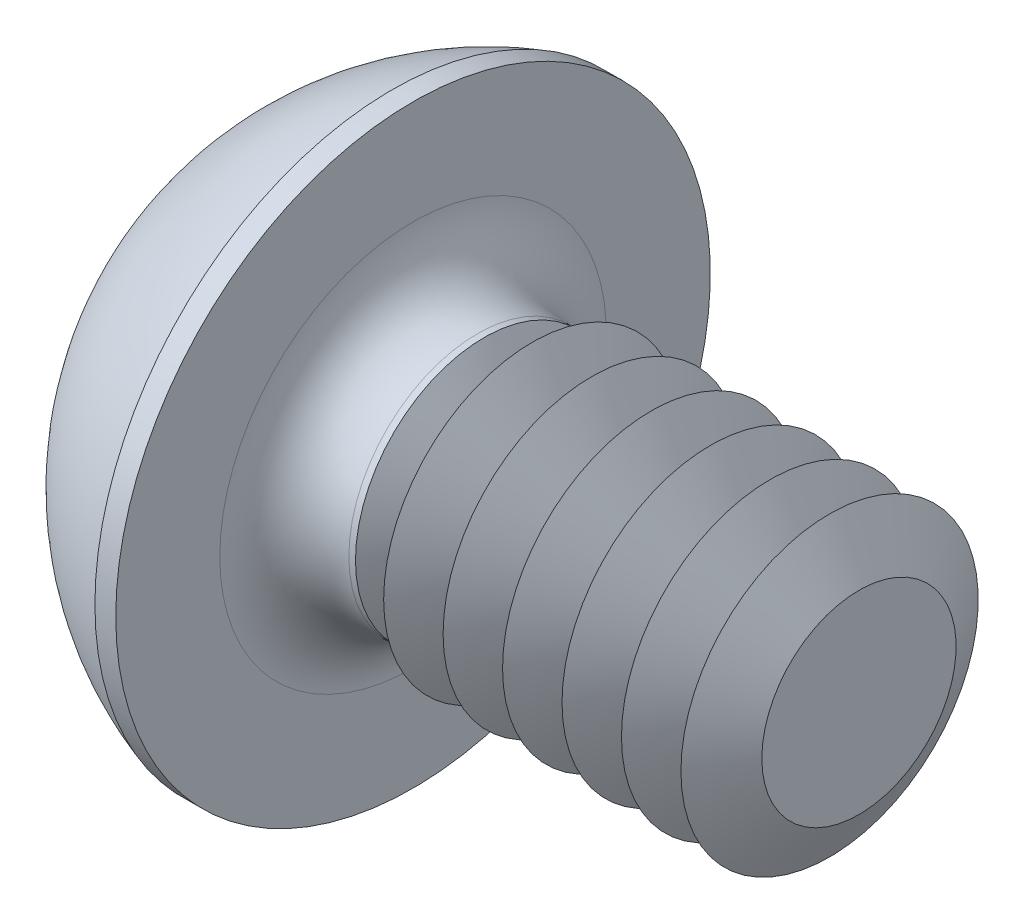
ISO-10303-21;
HEADER;
FILE_DESCRIPTION(('STEP AP214'),'2;1');
FILE_NAME('part.step','',(''),(''),'','','');
FILE_SCHEMA(('AUTOMOTIVE_DESIGN { 1 0 10303 214 1 1 1 1 }'));
ENDSEC;
DATA;
#1=APPLICATION_CONTEXT('core data for automotive mechanical design processes');
#2=APPLICATION_PROTOCOL_DEFINITION('international standard','automotive_design',2000,#1);
#3=PRODUCT_CONTEXT('',#1,'mechanical');
#4=PRODUCT('Part','Part','',(#3));
#5=PRODUCT_RELATED_PRODUCT_CATEGORY('part','',(#4));
#6=PRODUCT_DEFINITION_FORMATION('','',#4);
#7=PRODUCT_DEFINITION_CONTEXT('part definition',#1,'design');
#8=PRODUCT_DEFINITION('design','',#6,#7);
#9=PRODUCT_DEFINITION_SHAPE('','',#8);
#10=(LENGTH_UNIT() NAMED_UNIT(*) SI_UNIT(.MILLI.,.METRE.));
#11=(NAMED_UNIT(*) PLANE_ANGLE_UNIT() SI_UNIT($,.RADIAN.));
#12=(NAMED_UNIT(*) SI_UNIT($,.STERADIAN.) SOLID_ANGLE_UNIT());
#13=UNCERTAINTY_MEASURE_WITH_UNIT(LENGTH_MEASURE(1.E-05),#10,'distance_accuracy_value','');
#14=(GEOMETRIC_REPRESENTATION_CONTEXT(3) GLOBAL_UNCERTAINTY_ASSIGNED_CONTEXT((#13)) GLOBAL_UNIT_ASSIGNED_CONTEXT((#10,
#11,#12)) REPRESENTATION_CONTEXT('',''));
#15=CARTESIAN_POINT('',(0.,0.,0.));
#16=DIRECTION('',(0.,0.,1.));
#17=DIRECTION('',(1.,0.,0.));
#18=AXIS2_PLACEMENT_3D('',#15,#16,#17);
#19=CARTESIAN_POINT('',(1.2,0.,0.));
#20=DIRECTION('',(0.164398987305357,0.,-0.986393923832144));
#21=DIRECTION('',(-0.986393923832144,0.,-0.164398987305357));
#22=AXIS2_PLACEMENT_3D('',#19,#20,#21);
#23=PLANE('',#22);
#24=DIRECTION('',(-0.777436258070084,-0.61547037097215,-0.129572709678347));
#25=VECTOR('',#24,1.);
#26=CARTESIAN_POINT('',(1.2,0.,0.));
#27=LINE('',#26,#25);
#28=CARTESIAN_POINT('',(1.2,0.,0.));
#29=VERTEX_POINT('',#28);
#30=CARTESIAN_POINT('',(0.171781586834319,-0.814006243756164,-0.171369735527614));
#31=VERTEX_POINT('',#30);
#32=EDGE_CURVE('E155',#29,#31,#27,.T.);
#33=ORIENTED_EDGE('',*,*,#32,.F.);
#34=DIRECTION('',(-0.973328526784575,-0.162221421130762,-0.162221421130763));
#35=VECTOR('',#34,1.);
#36=CARTESIAN_POINT('',(1.2,0.,0.));
#37=LINE('',#36,#35);
#38=CARTESIAN_POINT('',(0.0185453159762638,-0.196909114003955,-0.196909114003956));
#39=VERTEX_POINT('',#38);
#40=EDGE_CURVE('E116',#29,#39,#37,.T.);
#41=ORIENTED_EDGE('',*,*,#40,.T.);
#42=CARTESIAN_POINT('',(2.07567567567568,0.,0.145945945945946));
#43=DIRECTION('',(0.164398987305357,0.,-0.986393923832144));
#44=DIRECTION('',(-0.986393923832144,0.,-0.164398987305357));
#45=AXIS2_PLACEMENT_3D('',#42,#43,#44);
#46=CIRCLE('',#45,2.09478115995636);
#47=EDGE_CURVE('E129',#31,#39,#46,.T.);
#48=ORIENTED_EDGE('',*,*,#47,.F.);
#49=EDGE_LOOP('',(#33,#41,#48));
#50=FACE_BOUND('',#49,.T.);
#51=ADVANCED_FACE('F36',(#50),#23,.F.);
#52=CARTESIAN_POINT('',(1.2,0.,0.));
#53=DIRECTION('',(0.164398987305357,0.,0.986393923832144));
#54=DIRECTION('',(0.986393923832144,0.,-0.164398987305357));
#55=AXIS2_PLACEMENT_3D('',#52,#53,#54);
#56=PLANE('',#55);
#57=CARTESIAN_POINT('',(2.07567567567568,0.,-0.145945945945946));
#58=DIRECTION('',(0.164398987305357,0.,0.986393923832144));
#59=DIRECTION('',(0.986393923832144,0.,-0.164398987305357));
#60=AXIS2_PLACEMENT_3D('',#57,#58,#59);
#61=CIRCLE('',#60,2.09478115995636);
#62=CARTESIAN_POINT('',(0.0185453159762634,-0.196909114003957,0.196909114003956));
#63=VERTEX_POINT('',#62);
#64=CARTESIAN_POINT('',(0.171781586834319,-0.814006243756164,0.171369735527614));
#65=VERTEX_POINT('',#64);
#66=EDGE_CURVE('E59',#63,#65,#61,.T.);
#67=ORIENTED_EDGE('',*,*,#66,.F.);
#68=DIRECTION('',(0.973328526784575,0.162221421130763,-0.162221421130763));
#69=VECTOR('',#68,1.);
#70=CARTESIAN_POINT('',(1.2,0.,0.));
#71=LINE('',#70,#69);
#72=EDGE_CURVE('E11',#63,#29,#71,.T.);
#73=ORIENTED_EDGE('',*,*,#72,.T.);
#74=DIRECTION('',(-0.777436258070084,-0.61547037097215,0.129572709678347));
#75=VECTOR('',#74,1.);
#76=CARTESIAN_POINT('',(1.2,0.,0.));
#77=LINE('',#76,#75);
#78=EDGE_CURVE('E156',#29,#65,#77,.T.);
#79=ORIENTED_EDGE('',*,*,#78,.T.);
#80=EDGE_LOOP('',(#67,#73,#79));
#81=FACE_BOUND('',#80,.T.);
#82=ADVANCED_FACE('F171',(#81),#56,.F.);
#83=CARTESIAN_POINT('',(3.20216640229767,0.,0.));
#84=DIRECTION('',(-1.,0.,0.));
#85=DIRECTION('',(0.,0.,1.));
#86=AXIS2_PLACEMENT_3D('',#83,#84,#85);
#87=CONICAL_SURFACE('',#86,0.999999999999995,1.05188801855284);
#88=CARTESIAN_POINT('',(3.4,0.,0.));
#89=DIRECTION('',(-1.,0.,0.));
#90=DIRECTION('',(0.,0.,1.));
#91=AXIS2_PLACEMENT_3D('',#88,#89,#90);
#92=CIRCLE('',#91,0.653599999999999);
#93=CARTESIAN_POINT('',(3.4,0.,0.653599999999999));
#94=VERTEX_POINT('',#93);
#95=EDGE_CURVE('E205',#94,#94,#92,.T.);
#96=ORIENTED_EDGE('',*,*,#95,.T.);
#97=EDGE_LOOP('',(#96));
#98=FACE_BOUND('',#97,.T.);
#99=CARTESIAN_POINT('',(3.20216640229768,0.,0.));
#100=DIRECTION('',(-1.,0.,0.));
#101=DIRECTION('',(0.,0.,1.));
#102=AXIS2_PLACEMENT_3D('',#99,#100,#101);
#103=CIRCLE('',#102,0.999999999999994);
#104=CARTESIAN_POINT('',(3.20216640229768,0.,0.999999999999994));
#105=VERTEX_POINT('',#104);
#106=EDGE_CURVE('E202',#105,#105,#103,.T.);
#107=ORIENTED_EDGE('',*,*,#106,.F.);
#108=EDGE_LOOP('',(#107));
#109=FACE_BOUND('',#108,.T.);
#110=ADVANCED_FACE('F279',(#98,#109),#87,.T.);
#111=CARTESIAN_POINT('',(3.4,0.,0.));
#112=DIRECTION('',(1.,0.,0.));
#113=DIRECTION('',(0.,0.,-1.));
#114=AXIS2_PLACEMENT_3D('',#111,#112,#113);
#115=CONICAL_SURFACE('',#114,0.653599999999999,1.04250708384035);
#116=CARTESIAN_POINT('',(3.60216640229768,0.,0.));
#117=DIRECTION('',(-1.,0.,0.));
#118=DIRECTION('',(0.,0.,1.));
#119=AXIS2_PLACEMENT_3D('',#116,#117,#118);
#120=CIRCLE('',#119,0.999999999999994);
#121=CARTESIAN_POINT('',(3.60216640229768,0.,0.999999999999994));
#122=VERTEX_POINT('',#121);
#123=EDGE_CURVE('E208',#122,#122,#120,.T.);
#124=ORIENTED_EDGE('',*,*,#123,.T.);
#125=EDGE_LOOP('',(#124));
#126=FACE_BOUND('',#125,.T.);
#127=ORIENTED_EDGE('',*,*,#95,.F.);
#128=EDGE_LOOP('',(#127));
#129=FACE_BOUND('',#128,.T.);
#130=ADVANCED_FACE('F457',(#126,#129),#115,.T.);
#131=CARTESIAN_POINT('',(4.6,0.,0.));
#132=DIRECTION('',(-1.,0.,0.));
#133=DIRECTION('',(0.,0.,1.));
#134=AXIS2_PLACEMENT_3D('',#131,#132,#133);
#135=PLANE('',#134);
#136=CARTESIAN_POINT('',(4.6,0.,0.));
#137=DIRECTION('',(-1.,0.,0.));
#138=DIRECTION('',(0.,0.,1.));
#139=AXIS2_PLACEMENT_3D('',#136,#137,#138);
#140=CIRCLE('',#139,0.653599999999999);
#141=CARTESIAN_POINT('',(4.6,0.,0.653599999999999));
#142=VERTEX_POINT('',#141);
#143=EDGE_CURVE('E223',#142,#142,#140,.T.);
#144=ORIENTED_EDGE('',*,*,#143,.F.);
#145=EDGE_LOOP('',(#144));
#146=FACE_BOUND('',#145,.T.);
#147=ADVANCED_FACE('F461',(#146),#135,.F.);
#148=CARTESIAN_POINT('',(4.40216640229768,0.,0.));
#149=DIRECTION('',(-1.,0.,0.));
#150=DIRECTION('',(0.,0.,1.));
#151=AXIS2_PLACEMENT_3D('',#148,#149,#150);
#152=CONICAL_SURFACE('',#151,0.999999999999995,1.05188801855284);
#153=ORIENTED_EDGE('',*,*,#143,.T.);
#154=EDGE_LOOP('',(#153));
#155=FACE_BOUND('',#154,.T.);
#156=CARTESIAN_POINT('',(4.40216640229768,0.,0.));
#157=DIRECTION('',(-1.,0.,0.));
#158=DIRECTION('',(0.,0.,1.));
#159=AXIS2_PLACEMENT_3D('',#156,#157,#158);
#160=CIRCLE('',#159,0.999999999999994);
#161=CARTESIAN_POINT('',(4.40216640229768,0.,0.999999999999994));
#162=VERTEX_POINT('',#161);
#163=EDGE_CURVE('E220',#162,#162,#160,.T.);
#164=ORIENTED_EDGE('',*,*,#163,.F.);
#165=EDGE_LOOP('',(#164));
#166=FACE_BOUND('',#165,.T.);
#167=ADVANCED_FACE('F449',(#155,#166),#152,.T.);
#168=CARTESIAN_POINT('',(4.2,0.,0.));
#169=DIRECTION('',(1.,0.,0.));
#170=DIRECTION('',(0.,0.,-1.));
#171=AXIS2_PLACEMENT_3D('',#168,#169,#170);
#172=CONICAL_SURFACE('',#171,0.653599999999999,1.04250708384035);
#173=ORIENTED_EDGE('',*,*,#163,.T.);
#174=EDGE_LOOP('',(#173));
#175=FACE_BOUND('',#174,.T.);
#176=CARTESIAN_POINT('',(4.2,0.,0.));
#177=DIRECTION('',(-1.,0.,0.));
#178=DIRECTION('',(0.,0.,1.));
#179=AXIS2_PLACEMENT_3D('',#176,#177,#178);
#180=CIRCLE('',#179,0.653599999999999);
#181=CARTESIAN_POINT('',(4.2,0.,0.653599999999999));
#182=VERTEX_POINT('',#181);
#183=EDGE_CURVE('E217',#182,#182,#180,.T.);
#184=ORIENTED_EDGE('',*,*,#183,.F.);
#185=EDGE_LOOP('',(#184));
#186=FACE_BOUND('',#185,.T.);
#187=ADVANCED_FACE('F439',(#175,#186),#172,.T.);
#188=CARTESIAN_POINT('',(4.00216640229768,0.,0.));
#189=DIRECTION('',(-1.,0.,0.));
#190=DIRECTION('',(0.,0.,1.));
#191=AXIS2_PLACEMENT_3D('',#188,#189,#190);
#192=CONICAL_SURFACE('',#191,0.999999999999995,1.05188801855284);
#193=ORIENTED_EDGE('',*,*,#183,.T.);
#194=EDGE_LOOP('',(#193));
#195=FACE_BOUND('',#194,.T.);
#196=CARTESIAN_POINT('',(4.00216640229768,0.,0.));
#197=DIRECTION('',(-1.,0.,0.));
#198=DIRECTION('',(0.,0.,1.));
#199=AXIS2_PLACEMENT_3D('',#196,#197,#198);
#200=CIRCLE('',#199,0.999999999999994);
#201=CARTESIAN_POINT('',(4.00216640229768,0.,0.999999999999994));
#202=VERTEX_POINT('',#201);
#203=EDGE_CURVE('E214',#202,#202,#200,.T.);
#204=ORIENTED_EDGE('',*,*,#203,.F.);
#205=EDGE_LOOP('',(#204));
#206=FACE_BOUND('',#205,.T.);
#207=ADVANCED_FACE('F429',(#195,#206),#192,.T.);
#208=CARTESIAN_POINT('',(3.8,0.,0.));
#209=DIRECTION('',(1.,0.,0.));
#210=DIRECTION('',(0.,0.,-1.));
#211=AXIS2_PLACEMENT_3D('',#208,#209,#210);
#212=CONICAL_SURFACE('',#211,0.653599999999999,1.04250708384035);
#213=ORIENTED_EDGE('',*,*,#203,.T.);
#214=EDGE_LOOP('',(#213));
#215=FACE_BOUND('',#214,.T.);
#216=CARTESIAN_POINT('',(3.8,0.,0.));
#217=DIRECTION('',(-1.,0.,0.));
#218=DIRECTION('',(0.,0.,1.));
#219=AXIS2_PLACEMENT_3D('',#216,#217,#218);
#220=CIRCLE('',#219,0.653599999999999);
#221=CARTESIAN_POINT('',(3.8,0.,0.653599999999999));
#222=VERTEX_POINT('',#221);
#223=EDGE_CURVE('E211',#222,#222,#220,.T.);
#224=ORIENTED_EDGE('',*,*,#223,.F.);
#225=EDGE_LOOP('',(#224));
#226=FACE_BOUND('',#225,.T.);
#227=ADVANCED_FACE('F419',(#215,#226),#212,.T.);
#228=CARTESIAN_POINT('',(3.60216640229768,0.,0.));
#229=DIRECTION('',(-1.,0.,0.));
#230=DIRECTION('',(0.,0.,1.));
#231=AXIS2_PLACEMENT_3D('',#228,#229,#230);
#232=CONICAL_SURFACE('',#231,0.999999999999995,1.05188801855284);
#233=ORIENTED_EDGE('',*,*,#223,.T.);
#234=EDGE_LOOP('',(#233));
#235=FACE_BOUND('',#234,.T.);
#236=ORIENTED_EDGE('',*,*,#123,.F.);
#237=EDGE_LOOP('',(#236));
#238=FACE_BOUND('',#237,.T.);
#239=ADVANCED_FACE('F409',(#235,#238),#232,.T.);
#240=CARTESIAN_POINT('',(2.80216640229768,0.,0.));
#241=DIRECTION('',(-1.,0.,0.));
#242=DIRECTION('',(0.,0.,1.));
#243=AXIS2_PLACEMENT_3D('',#240,#241,#242);
#244=CONICAL_SURFACE('',#243,0.999999999999995,1.05188801855284);
#245=CARTESIAN_POINT('',(3.,0.,0.));
#246=DIRECTION('',(-1.,0.,0.));
#247=DIRECTION('',(0.,0.,1.));
#248=AXIS2_PLACEMENT_3D('',#245,#246,#247);
#249=CIRCLE('',#248,0.653599999999999);
#250=CARTESIAN_POINT('',(3.,0.,0.653599999999999));
#251=VERTEX_POINT('',#250);
#252=EDGE_CURVE('E199',#251,#251,#249,.T.);
#253=ORIENTED_EDGE('',*,*,#252,.T.);
#254=EDGE_LOOP('',(#253));
#255=FACE_BOUND('',#254,.T.);
#256=CARTESIAN_POINT('',(2.80216640229768,0.,0.));
#257=DIRECTION('',(-1.,0.,0.));
#258=DIRECTION('',(0.,0.,1.));
#259=AXIS2_PLACEMENT_3D('',#256,#257,#258);
#260=CIRCLE('',#259,0.999999999999994);
#261=CARTESIAN_POINT('',(2.80216640229768,0.,0.999999999999994));
#262=VERTEX_POINT('',#261);
#263=EDGE_CURVE('E196',#262,#262,#260,.T.);
#264=ORIENTED_EDGE('',*,*,#263,.F.);
#265=EDGE_LOOP('',(#264));
#266=FACE_BOUND('',#265,.T.);
#267=ADVANCED_FACE('F399',(#255,#266),#244,.T.);
#268=CARTESIAN_POINT('',(3.,0.,0.));
#269=DIRECTION('',(1.,0.,0.));
#270=DIRECTION('',(0.,0.,-1.));
#271=AXIS2_PLACEMENT_3D('',#268,#269,#270);
#272=CONICAL_SURFACE('',#271,0.653599999999999,1.04250708384035);
#273=ORIENTED_EDGE('',*,*,#106,.T.);
#274=EDGE_LOOP('',(#273));
#275=FACE_BOUND('',#274,.T.);
#276=ORIENTED_EDGE('',*,*,#252,.F.);
#277=EDGE_LOOP('',(#276));
#278=FACE_BOUND('',#277,.T.);
#279=ADVANCED_FACE('F389',(#275,#278),#272,.T.);
#280=CARTESIAN_POINT('',(2.40216640229767,0.,0.));
#281=DIRECTION('',(-1.,0.,0.));
#282=DIRECTION('',(0.,0.,1.));
#283=AXIS2_PLACEMENT_3D('',#280,#281,#282);
#284=CONICAL_SURFACE('',#283,0.999999999999995,1.05188801855284);
#285=CARTESIAN_POINT('',(2.6,0.,0.));
#286=DIRECTION('',(-1.,0.,0.));
#287=DIRECTION('',(0.,0.,1.));
#288=AXIS2_PLACEMENT_3D('',#285,#286,#287);
#289=CIRCLE('',#288,0.653599999999999);
#290=CARTESIAN_POINT('',(2.6,0.,0.653599999999999));
#291=VERTEX_POINT('',#290);
#292=EDGE_CURVE('E193',#291,#291,#289,.T.);
#293=ORIENTED_EDGE('',*,*,#292,.T.);
#294=EDGE_LOOP('',(#293));
#295=FACE_BOUND('',#294,.T.);
#296=CARTESIAN_POINT('',(2.40216640229767,0.,0.));
#297=DIRECTION('',(-1.,0.,0.));
#298=DIRECTION('',(0.,0.,1.));
#299=AXIS2_PLACEMENT_3D('',#296,#297,#298);
#300=CIRCLE('',#299,0.999999999999994);
#301=CARTESIAN_POINT('',(2.40216640229767,0.,0.999999999999994));
#302=VERTEX_POINT('',#301);
#303=EDGE_CURVE('E190',#302,#302,#300,.T.);
#304=ORIENTED_EDGE('',*,*,#303,.F.);
#305=EDGE_LOOP('',(#304));
#306=FACE_BOUND('',#305,.T.);
#307=ADVANCED_FACE('F271',(#295,#306),#284,.T.);
#308=CARTESIAN_POINT('',(2.6,0.,0.));
#309=DIRECTION('',(1.,0.,0.));
#310=DIRECTION('',(0.,0.,-1.));
#311=AXIS2_PLACEMENT_3D('',#308,#309,#310);
#312=CONICAL_SURFACE('',#311,0.653599999999999,1.04250708384035);
#313=ORIENTED_EDGE('',*,*,#263,.T.);
#314=EDGE_LOOP('',(#313));
#315=FACE_BOUND('',#314,.T.);
#316=ORIENTED_EDGE('',*,*,#292,.F.);
#317=EDGE_LOOP('',(#316));
#318=FACE_BOUND('',#317,.T.);
#319=ADVANCED_FACE('F262',(#315,#318),#312,.T.);
#320=CARTESIAN_POINT('',(2.00216640229768,0.,0.));
#321=DIRECTION('',(-1.,0.,0.));
#322=DIRECTION('',(0.,0.,1.));
#323=AXIS2_PLACEMENT_3D('',#320,#321,#322);
#324=CONICAL_SURFACE('',#323,0.999999999999995,1.05188801855284);
#325=CARTESIAN_POINT('',(2.2,0.,0.));
#326=DIRECTION('',(-1.,0.,0.));
#327=DIRECTION('',(0.,0.,1.));
#328=AXIS2_PLACEMENT_3D('',#325,#326,#327);
#329=CIRCLE('',#328,0.653599999999999);
#330=CARTESIAN_POINT('',(2.2,0.,0.653599999999999));
#331=VERTEX_POINT('',#330);
#332=EDGE_CURVE('E160',#331,#331,#329,.T.);
#333=ORIENTED_EDGE('',*,*,#332,.T.);
#334=EDGE_LOOP('',(#333));
#335=FACE_BOUND('',#334,.T.);
#336=CARTESIAN_POINT('',(2.07869556538114,0.,0.));
#337=DIRECTION('',(-1.,0.,0.));
#338=DIRECTION('',(0.,0.,1.));
#339=AXIS2_PLACEMENT_3D('',#336,#337,#338);
#340=CIRCLE('',#339,0.866);
#341=CARTESIAN_POINT('',(2.07869556538114,0.,0.866));
#342=VERTEX_POINT('',#341);
#343=EDGE_CURVE('E179',#342,#342,#340,.F.);
#344=ORIENTED_EDGE('',*,*,#343,.T.);
#345=EDGE_LOOP('',(#344));
#346=FACE_BOUND('',#345,.T.);
#347=ADVANCED_FACE('F259',(#335,#346),#324,.T.);
#348=CARTESIAN_POINT('',(2.2,0.,0.));
#349=DIRECTION('',(1.,0.,0.));
#350=DIRECTION('',(0.,0.,-1.));
#351=AXIS2_PLACEMENT_3D('',#348,#349,#350);
#352=CONICAL_SURFACE('',#351,0.653599999999999,1.04250708384035);
#353=ORIENTED_EDGE('',*,*,#303,.T.);
#354=EDGE_LOOP('',(#353));
#355=FACE_BOUND('',#354,.T.);
#356=ORIENTED_EDGE('',*,*,#332,.F.);
#357=EDGE_LOOP('',(#356));
#358=FACE_BOUND('',#357,.T.);
#359=ADVANCED_FACE('F261',(#355,#358),#352,.T.);
#360=CARTESIAN_POINT('',(2.1,0.,0.));
#361=DIRECTION('',(-1.,0.,0.));
#362=DIRECTION('',(0.,1.,0.));
#363=AXIS2_PLACEMENT_3D('',#360,#361,#362);
#364=SPHERICAL_SURFACE('',#363,2.1);
#365=CARTESIAN_POINT('',(1.75325506937033,0.,-0.437993596584845));
#366=DIRECTION('',(0.620702944365561,0.,0.784045824461761));
#367=DIRECTION('',(0.784045824461762,0.,-0.620702944365561));
#368=AXIS2_PLACEMENT_3D('',#365,#366,#367);
#369=CIRCLE('',#368,2.0243343504553);
#370=CARTESIAN_POINT('',(0.171781586834319,0.171369735527611,0.814006243756165));
#371=VERTEX_POINT('',#370);
#372=CARTESIAN_POINT('',(0.171781586834319,-0.171369735527616,0.814006243756164));
#373=VERTEX_POINT('',#372);
#374=EDGE_CURVE('E122',#371,#373,#369,.T.);
#375=ORIENTED_EDGE('',*,*,#374,.T.);
#376=CARTESIAN_POINT('',(2.07567567567568,0.145945945945946,0.));
#377=DIRECTION('',(0.164398987305357,-0.986393923832144,0.));
#378=DIRECTION('',(0.986393923832144,0.164398987305357,0.));
#379=AXIS2_PLACEMENT_3D('',#376,#377,#378);
#380=CIRCLE('',#379,2.09478115995636);
#381=EDGE_CURVE('E138',#373,#63,#380,.T.);
#382=ORIENTED_EDGE('',*,*,#381,.T.);
#383=ORIENTED_EDGE('',*,*,#66,.T.);
#384=CARTESIAN_POINT('',(1.75325506937033,0.437993596584845,0.));
#385=DIRECTION('',(0.620702944365561,-0.784045824461761,0.));
#386=DIRECTION('',(0.784045824461762,0.620702944365561,0.));
#387=AXIS2_PLACEMENT_3D('',#384,#385,#386);
#388=CIRCLE('',#387,2.0243343504553);
#389=EDGE_CURVE('E168',#65,#31,#388,.T.);
#390=ORIENTED_EDGE('',*,*,#389,.T.);
#391=ORIENTED_EDGE('',*,*,#47,.T.);
#392=CARTESIAN_POINT('',(0.171781586834319,-0.171369735527611,-0.814006243756165));
#393=VERTEX_POINT('',#392);
#394=EDGE_CURVE('E118',#39,#393,#380,.T.);
#395=ORIENTED_EDGE('',*,*,#394,.T.);
#396=CARTESIAN_POINT('',(1.75325506937033,0.,0.437993596584845));
#397=DIRECTION('',(0.620702944365561,0.,-0.784045824461761));
#398=DIRECTION('',(-0.784045824461762,0.,-0.620702944365561));
#399=AXIS2_PLACEMENT_3D('',#396,#397,#398);
#400=CIRCLE('',#399,2.0243343504553);
#401=CARTESIAN_POINT('',(0.171781586834319,0.171369735527616,-0.814006243756164));
#402=VERTEX_POINT('',#401);
#403=EDGE_CURVE('E110',#393,#402,#400,.T.);
#404=ORIENTED_EDGE('',*,*,#403,.T.);
#405=CARTESIAN_POINT('',(2.07567567567568,-0.145945945945946,0.));
#406=DIRECTION('',(0.164398987305357,0.986393923832144,0.));
#407=DIRECTION('',(-0.986393923832144,0.164398987305357,0.));
#408=AXIS2_PLACEMENT_3D('',#405,#406,#407);
#409=CIRCLE('',#408,2.09478115995636);
#410=CARTESIAN_POINT('',(0.0185453159762634,0.196909114003957,-0.196909114003956));
#411=VERTEX_POINT('',#410);
#412=EDGE_CURVE('E101',#402,#411,#409,.T.);
#413=ORIENTED_EDGE('',*,*,#412,.T.);
#414=CARTESIAN_POINT('',(0.171781586834319,0.814006243756164,-0.171369735527614));
#415=VERTEX_POINT('',#414);
#416=EDGE_CURVE('E146',#411,#415,#46,.T.);
#417=ORIENTED_EDGE('',*,*,#416,.T.);
#418=CARTESIAN_POINT('',(1.75325506937033,-0.437993596584845,0.));
#419=DIRECTION('',(0.620702944365561,0.784045824461761,0.));
#420=DIRECTION('',(-0.784045824461762,0.620702944365561,0.));
#421=AXIS2_PLACEMENT_3D('',#418,#419,#420);
#422=CIRCLE('',#421,2.0243343504553);
#423=CARTESIAN_POINT('',(0.171781586834319,0.814006243756164,0.171369735527613));
#424=VERTEX_POINT('',#423);
#425=EDGE_CURVE('E159',#415,#424,#422,.T.);
#426=ORIENTED_EDGE('',*,*,#425,.T.);
#427=CARTESIAN_POINT('',(0.0185453159762634,0.196909114003955,0.196909114003956));
#428=VERTEX_POINT('',#427);
#429=EDGE_CURVE('E151',#424,#428,#61,.T.);
#430=ORIENTED_EDGE('',*,*,#429,.T.);
#431=EDGE_CURVE('E51',#428,#371,#409,.T.);
#432=ORIENTED_EDGE('',*,*,#431,.T.);
#433=EDGE_LOOP('',(#375,#382,#383,#390,#391,#395,#404,#413,#417,#426,#430,#432));
#434=FACE_BOUND('',#433,.T.);
#435=CARTESIAN_POINT('',(1.45968757625671,0.,0.));
#436=DIRECTION('',(-1.,0.,0.));
#437=DIRECTION('',(0.,0.,1.));
#438=AXIS2_PLACEMENT_3D('',#435,#436,#437);
#439=CIRCLE('',#438,2.);
#440=CARTESIAN_POINT('',(1.45968757625671,0.,2.));
#441=VERTEX_POINT('',#440);
#442=EDGE_CURVE('E172',#441,#441,#439,.T.);
#443=ORIENTED_EDGE('',*,*,#442,.T.);
#444=EDGE_LOOP('',(#443));
#445=FACE_BOUND('',#444,.T.);
#446=ADVANCED_FACE('F38',(#434,#445),#364,.T.);
#447=CARTESIAN_POINT('',(-1.33175770411172,0.,0.));
#448=DIRECTION('',(-1.,0.,0.));
#449=DIRECTION('',(0.,0.,1.));
#450=AXIS2_PLACEMENT_3D('',#447,#448,#449);
#451=CYLINDRICAL_SURFACE('',#450,2.);
#452=ORIENTED_EDGE('',*,*,#442,.F.);
#453=EDGE_LOOP('',(#452));
#454=FACE_BOUND('',#453,.T.);
#455=CARTESIAN_POINT('',(1.6,0.,0.));
#456=DIRECTION('',(-1.,0.,0.));
#457=DIRECTION('',(0.,0.,1.));
#458=AXIS2_PLACEMENT_3D('',#455,#456,#457);
#459=CIRCLE('',#458,2.);
#460=CARTESIAN_POINT('',(1.6,0.,2.));
#461=VERTEX_POINT('',#460);
#462=EDGE_CURVE('E175',#461,#461,#459,.T.);
#463=ORIENTED_EDGE('',*,*,#462,.T.);
#464=EDGE_LOOP('',(#463));
#465=FACE_BOUND('',#464,.T.);
#466=ADVANCED_FACE('F238',(#454,#465),#451,.T.);
#467=CARTESIAN_POINT('',(1.6,1.3,0.));
#468=DIRECTION('',(-1.,0.,0.));
#469=DIRECTION('',(0.,0.,1.));
#470=AXIS2_PLACEMENT_3D('',#467,#468,#469);
#471=PLANE('',#470);
#472=ORIENTED_EDGE('',*,*,#462,.F.);
#473=EDGE_LOOP('',(#472));
#474=FACE_BOUND('',#473,.T.);
#475=CARTESIAN_POINT('',(1.6,0.,0.));
#476=DIRECTION('',(-1.,0.,0.));
#477=DIRECTION('',(0.,0.,1.));
#478=AXIS2_PLACEMENT_3D('',#475,#476,#477);
#479=CIRCLE('',#478,1.3);
#480=CARTESIAN_POINT('',(1.6,0.,1.3));
#481=VERTEX_POINT('',#480);
#482=EDGE_CURVE('E229',#481,#481,#479,.T.);
#483=ORIENTED_EDGE('',*,*,#482,.T.);
#484=EDGE_LOOP('',(#483));
#485=FACE_BOUND('',#484,.T.);
#486=ADVANCED_FACE('F240',(#474,#485),#471,.F.);
#487=CARTESIAN_POINT('',(2.034,0.,0.));
#488=DIRECTION('',(-1.,0.,0.));
#489=DIRECTION('',(0.,0.,1.));
#490=AXIS2_PLACEMENT_3D('',#487,#488,#489);
#491=TOROIDAL_SURFACE('',#490,1.3,0.434);
#492=ORIENTED_EDGE('',*,*,#482,.F.);
#493=EDGE_LOOP('',(#492));
#494=FACE_BOUND('',#493,.T.);
#495=CARTESIAN_POINT('',(2.034,0.,0.));
#496=DIRECTION('',(-1.,0.,0.));
#497=DIRECTION('',(0.,0.,1.));
#498=AXIS2_PLACEMENT_3D('',#495,#496,#497);
#499=CIRCLE('',#498,0.866);
#500=CARTESIAN_POINT('',(2.034,0.,0.866));
#501=VERTEX_POINT('',#500);
#502=EDGE_CURVE('E226',#501,#501,#499,.T.);
#503=ORIENTED_EDGE('',*,*,#502,.T.);
#504=EDGE_LOOP('',(#503));
#505=FACE_BOUND('',#504,.T.);
#506=ADVANCED_FACE('F243',(#494,#505),#491,.F.);
#507=CARTESIAN_POINT('',(-1.33175770411172,0.,0.));
#508=DIRECTION('',(-1.,0.,0.));
#509=DIRECTION('',(0.,0.,1.));
#510=AXIS2_PLACEMENT_3D('',#507,#508,#509);
#511=CYLINDRICAL_SURFACE('',#510,0.866);
#512=ORIENTED_EDGE('',*,*,#502,.F.);
#513=EDGE_LOOP('',(#512));
#514=FACE_BOUND('',#513,.T.);
#515=ORIENTED_EDGE('',*,*,#343,.F.);
#516=EDGE_LOOP('',(#515));
#517=FACE_BOUND('',#516,.T.);
#518=ADVANCED_FACE('F249',(#514,#517),#511,.T.);
#519=ORIENTED_EDGE('',*,*,#416,.F.);
#520=DIRECTION('',(0.973328526784575,-0.162221421130763,0.162221421130763));
#521=VECTOR('',#520,1.);
#522=CARTESIAN_POINT('',(1.2,0.,0.));
#523=LINE('',#522,#521);
#524=EDGE_CURVE('E99',#411,#29,#523,.T.);
#525=ORIENTED_EDGE('',*,*,#524,.T.);
#526=DIRECTION('',(-0.777436258070084,0.61547037097215,-0.129572709678347));
#527=VECTOR('',#526,1.);
#528=CARTESIAN_POINT('',(1.2,0.,0.));
#529=LINE('',#528,#527);
#530=EDGE_CURVE('E145',#29,#415,#529,.T.);
#531=ORIENTED_EDGE('',*,*,#530,.T.);
#532=EDGE_LOOP('',(#519,#525,#531));
#533=FACE_BOUND('',#532,.T.);
#534=ADVANCED_FACE('F143',(#533),#23,.F.);
#535=CARTESIAN_POINT('',(0.,0.95,-0.2));
#536=DIRECTION('',(0.620702944365561,0.784045824461761,0.));
#537=DIRECTION('',(-0.784045824461762,0.620702944365561,0.));
#538=AXIS2_PLACEMENT_3D('',#535,#536,#537);
#539=PLANE('',#538);
#540=ORIENTED_EDGE('',*,*,#530,.F.);
#541=DIRECTION('',(-0.777436258070084,0.61547037097215,0.129572709678347));
#542=VECTOR('',#541,1.);
#543=CARTESIAN_POINT('',(1.2,0.,0.));
#544=LINE('',#543,#542);
#545=EDGE_CURVE('E149',#29,#424,#544,.T.);
#546=ORIENTED_EDGE('',*,*,#545,.T.);
#547=ORIENTED_EDGE('',*,*,#425,.F.);
#548=EDGE_LOOP('',(#540,#546,#547));
#549=FACE_BOUND('',#548,.T.);
#550=ADVANCED_FACE('F158',(#549),#539,.F.);
#551=CARTESIAN_POINT('',(0.,-0.95,0.2));
#552=DIRECTION('',(0.620702944365561,-0.784045824461761,0.));
#553=DIRECTION('',(0.784045824461762,0.620702944365561,0.));
#554=AXIS2_PLACEMENT_3D('',#551,#552,#553);
#555=PLANE('',#554);
#556=ORIENTED_EDGE('',*,*,#78,.F.);
#557=ORIENTED_EDGE('',*,*,#32,.T.);
#558=ORIENTED_EDGE('',*,*,#389,.F.);
#559=EDGE_LOOP('',(#556,#557,#558));
#560=FACE_BOUND('',#559,.T.);
#561=ADVANCED_FACE('F167',(#560),#555,.F.);
#562=ORIENTED_EDGE('',*,*,#545,.F.);
#563=DIRECTION('',(-0.973328526784575,0.162221421130762,0.162221421130763));
#564=VECTOR('',#563,1.);
#565=CARTESIAN_POINT('',(1.2,0.,0.));
#566=LINE('',#565,#564);
#567=EDGE_CURVE('E44',#29,#428,#566,.T.);
#568=ORIENTED_EDGE('',*,*,#567,.T.);
#569=ORIENTED_EDGE('',*,*,#429,.F.);
#570=EDGE_LOOP('',(#562,#568,#569));
#571=FACE_BOUND('',#570,.T.);
#572=ADVANCED_FACE('F150',(#571),#56,.F.);
#573=CARTESIAN_POINT('',(1.2,0.,0.));
#574=DIRECTION('',(0.164398987305357,-0.986393923832144,0.));
#575=DIRECTION('',(-0.986393923832144,-0.164398987305357,0.));
#576=AXIS2_PLACEMENT_3D('',#573,#574,#575);
#577=PLANE('',#576);
#578=DIRECTION('',(-0.777436258070084,-0.12957270967835,0.61547037097215));
#579=VECTOR('',#578,1.);
#580=CARTESIAN_POINT('',(1.2,0.,0.));
#581=LINE('',#580,#579);
#582=EDGE_CURVE('E113',#29,#373,#581,.T.);
#583=ORIENTED_EDGE('',*,*,#582,.F.);
#584=ORIENTED_EDGE('',*,*,#72,.F.);
#585=ORIENTED_EDGE('',*,*,#381,.F.);
#586=EDGE_LOOP('',(#583,#584,#585));
#587=FACE_BOUND('',#586,.T.);
#588=ADVANCED_FACE('F137',(#587),#577,.F.);
#589=CARTESIAN_POINT('',(1.2,0.,0.));
#590=DIRECTION('',(0.164398987305357,0.986393923832144,0.));
#591=DIRECTION('',(0.986393923832144,-0.164398987305357,0.));
#592=AXIS2_PLACEMENT_3D('',#589,#590,#591);
#593=PLANE('',#592);
#594=ORIENTED_EDGE('',*,*,#567,.F.);
#595=DIRECTION('',(-0.777436258070084,0.129572709678345,0.615470370972151));
#596=VECTOR('',#595,1.);
#597=CARTESIAN_POINT('',(1.2,0.,0.));
#598=LINE('',#597,#596);
#599=EDGE_CURVE('E104',#29,#371,#598,.T.);
#600=ORIENTED_EDGE('',*,*,#599,.T.);
#601=ORIENTED_EDGE('',*,*,#431,.F.);
#602=EDGE_LOOP('',(#594,#600,#601));
#603=FACE_BOUND('',#602,.T.);
#604=ADVANCED_FACE('F125',(#603),#593,.F.);
#605=CARTESIAN_POINT('',(0.,-0.200000000000003,0.949999999999999));
#606=DIRECTION('',(0.620702944365561,0.,0.784045824461761));
#607=DIRECTION('',(-0.784045824461762,0.,0.620702944365561));
#608=AXIS2_PLACEMENT_3D('',#605,#606,#607);
#609=PLANE('',#608);
#610=ORIENTED_EDGE('',*,*,#599,.F.);
#611=ORIENTED_EDGE('',*,*,#582,.T.);
#612=ORIENTED_EDGE('',*,*,#374,.F.);
#613=EDGE_LOOP('',(#610,#611,#612));
#614=FACE_BOUND('',#613,.T.);
#615=ADVANCED_FACE('F133',(#614),#609,.F.);
#616=ORIENTED_EDGE('',*,*,#40,.F.);
#617=DIRECTION('',(-0.777436258070084,-0.129572709678345,-0.615470370972151));
#618=VECTOR('',#617,1.);
#619=CARTESIAN_POINT('',(1.2,0.,0.));
#620=LINE('',#619,#618);
#621=EDGE_CURVE('E107',#29,#393,#620,.T.);
#622=ORIENTED_EDGE('',*,*,#621,.T.);
#623=ORIENTED_EDGE('',*,*,#394,.F.);
#624=EDGE_LOOP('',(#616,#622,#623));
#625=FACE_BOUND('',#624,.T.);
#626=ADVANCED_FACE('F117',(#625),#577,.F.);
#627=CARTESIAN_POINT('',(0.,0.200000000000004,-0.949999999999999));
#628=DIRECTION('',(0.620702944365561,0.,-0.784045824461761));
#629=DIRECTION('',(0.784045824461762,0.,0.620702944365561));
#630=AXIS2_PLACEMENT_3D('',#627,#628,#629);
#631=PLANE('',#630);
#632=ORIENTED_EDGE('',*,*,#621,.F.);
#633=DIRECTION('',(-0.777436258070084,0.12957270967835,-0.61547037097215));
#634=VECTOR('',#633,1.);
#635=CARTESIAN_POINT('',(1.2,0.,0.));
#636=LINE('',#635,#634);
#637=EDGE_CURVE('E95',#29,#402,#636,.T.);
#638=ORIENTED_EDGE('',*,*,#637,.T.);
#639=ORIENTED_EDGE('',*,*,#403,.F.);
#640=EDGE_LOOP('',(#632,#638,#639));
#641=FACE_BOUND('',#640,.T.);
#642=ADVANCED_FACE('F109',(#641),#631,.F.);
#643=ORIENTED_EDGE('',*,*,#637,.F.);
#644=ORIENTED_EDGE('',*,*,#524,.F.);
#645=ORIENTED_EDGE('',*,*,#412,.F.);
#646=EDGE_LOOP('',(#643,#644,#645));
#647=FACE_BOUND('',#646,.T.);
#648=ADVANCED_FACE('F97',(#647),#593,.F.);
#649=CLOSED_SHELL('',(#51,#82,#110,#130,#147,#167,#187,#207,#227,#239,#267,#279,#307,#319,#347,
#359,#446,#466,#486,#506,#518,#534,#550,#561,#572,#588,#604,#615,#626,#642,#648));
#650=MANIFOLD_SOLID_BREP('B2',#649);
#651=ADVANCED_BREP_SHAPE_REPRESENTATION('',(#18,#650),#14);
#652=SHAPE_DEFINITION_REPRESENTATION(#9,#651);
ENDSEC;
END-ISO-10303-21;
